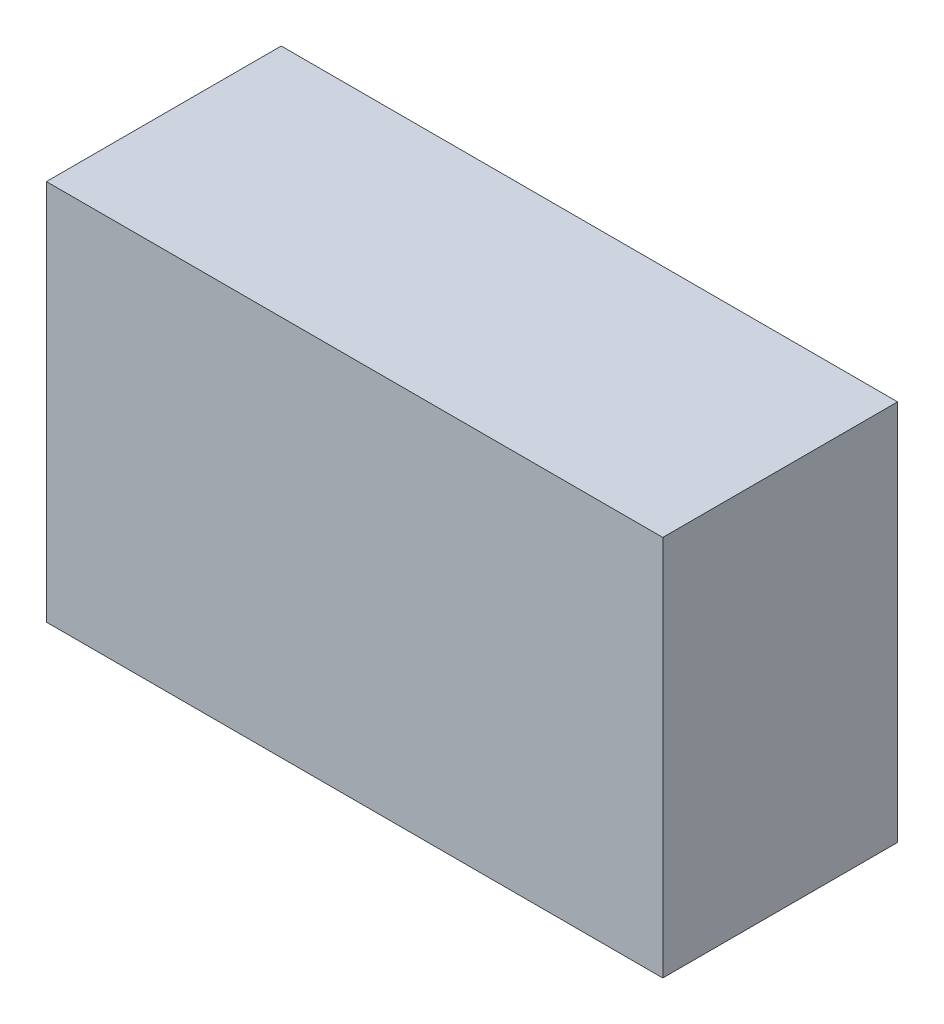
ISO-10303-21;
HEADER;
FILE_DESCRIPTION(('STEP AP214'),'2;1');
FILE_NAME('part.step','',(''),(''),'','','');
FILE_SCHEMA(('AUTOMOTIVE_DESIGN { 1 0 10303 214 1 1 1 1 }'));
ENDSEC;
DATA;
#1=APPLICATION_CONTEXT('core data for automotive mechanical design processes');
#2=APPLICATION_PROTOCOL_DEFINITION('international standard','automotive_design',2000,#1);
#3=PRODUCT_CONTEXT('',#1,'mechanical');
#4=PRODUCT('Part','Part','',(#3));
#5=PRODUCT_RELATED_PRODUCT_CATEGORY('part','',(#4));
#6=PRODUCT_DEFINITION_FORMATION('','',#4);
#7=PRODUCT_DEFINITION_CONTEXT('part definition',#1,'design');
#8=PRODUCT_DEFINITION('design','',#6,#7);
#9=PRODUCT_DEFINITION_SHAPE('','',#8);
#10=(LENGTH_UNIT() NAMED_UNIT(*) SI_UNIT(.MILLI.,.METRE.));
#11=(NAMED_UNIT(*) PLANE_ANGLE_UNIT() SI_UNIT($,.RADIAN.));
#12=(NAMED_UNIT(*) SI_UNIT($,.STERADIAN.) SOLID_ANGLE_UNIT());
#13=UNCERTAINTY_MEASURE_WITH_UNIT(LENGTH_MEASURE(1.E-05),#10,'distance_accuracy_value','');
#14=(GEOMETRIC_REPRESENTATION_CONTEXT(3) GLOBAL_UNCERTAINTY_ASSIGNED_CONTEXT((#13)) GLOBAL_UNIT_ASSIGNED_CONTEXT((#10,
#11,#12)) REPRESENTATION_CONTEXT('',''));
#15=CARTESIAN_POINT('',(0.,0.,0.));
#16=DIRECTION('',(0.,0.,1.));
#17=DIRECTION('',(1.,0.,0.));
#18=AXIS2_PLACEMENT_3D('',#15,#16,#17);
#19=CARTESIAN_POINT('',(-52.5,65.,20.));
#20=DIRECTION('',(1.,0.,0.));
#21=DIRECTION('',(0.,0.,-1.));
#22=AXIS2_PLACEMENT_3D('',#19,#20,#21);
#23=PLANE('',#22);
#24=DIRECTION('',(0.,0.,1.));
#25=VECTOR('',#24,1.);
#26=CARTESIAN_POINT('',(-52.5,0.,20.));
#27=LINE('',#26,#25);
#28=CARTESIAN_POINT('',(-52.5,0.,-20.));
#29=VERTEX_POINT('',#28);
#30=CARTESIAN_POINT('',(-52.5,0.,20.));
#31=VERTEX_POINT('',#30);
#32=EDGE_CURVE('E107',#29,#31,#27,.T.);
#33=ORIENTED_EDGE('',*,*,#32,.T.);
#34=DIRECTION('',(0.,-1.,0.));
#35=VECTOR('',#34,1.);
#36=CARTESIAN_POINT('',(-52.5,65.,20.));
#37=LINE('',#36,#35);
#38=CARTESIAN_POINT('',(-52.5,65.,20.));
#39=VERTEX_POINT('',#38);
#40=EDGE_CURVE('E11',#39,#31,#37,.T.);
#41=ORIENTED_EDGE('',*,*,#40,.F.);
#42=DIRECTION('',(0.,0.,1.));
#43=VECTOR('',#42,1.);
#44=CARTESIAN_POINT('',(-52.5,65.,20.));
#45=LINE('',#44,#43);
#46=CARTESIAN_POINT('',(-52.5,65.,-20.));
#47=VERTEX_POINT('',#46);
#48=EDGE_CURVE('E91',#47,#39,#45,.T.);
#49=ORIENTED_EDGE('',*,*,#48,.F.);
#50=DIRECTION('',(0.,-1.,0.));
#51=VECTOR('',#50,1.);
#52=CARTESIAN_POINT('',(-52.5,65.,-20.));
#53=LINE('',#52,#51);
#54=EDGE_CURVE('E103',#47,#29,#53,.T.);
#55=ORIENTED_EDGE('',*,*,#54,.T.);
#56=EDGE_LOOP('',(#33,#41,#49,#55));
#57=FACE_BOUND('',#56,.T.);
#58=ADVANCED_FACE('F39',(#57),#23,.F.);
#59=CARTESIAN_POINT('',(52.5,65.,20.));
#60=DIRECTION('',(0.,0.,-1.));
#61=DIRECTION('',(-1.,0.,0.));
#62=AXIS2_PLACEMENT_3D('',#59,#60,#61);
#63=PLANE('',#62);
#64=DIRECTION('',(1.,0.,0.));
#65=VECTOR('',#64,1.);
#66=CARTESIAN_POINT('',(52.5,0.,20.));
#67=LINE('',#66,#65);
#68=CARTESIAN_POINT('',(52.5,0.,20.));
#69=VERTEX_POINT('',#68);
#70=EDGE_CURVE('E96',#31,#69,#67,.T.);
#71=ORIENTED_EDGE('',*,*,#70,.T.);
#72=DIRECTION('',(0.,-1.,0.));
#73=VECTOR('',#72,1.);
#74=CARTESIAN_POINT('',(52.5,65.,20.));
#75=LINE('',#74,#73);
#76=CARTESIAN_POINT('',(52.5,65.,20.));
#77=VERTEX_POINT('',#76);
#78=EDGE_CURVE('E48',#77,#69,#75,.T.);
#79=ORIENTED_EDGE('',*,*,#78,.F.);
#80=DIRECTION('',(1.,0.,0.));
#81=VECTOR('',#80,1.);
#82=CARTESIAN_POINT('',(52.5,65.,20.));
#83=LINE('',#82,#81);
#84=EDGE_CURVE('E86',#39,#77,#83,.T.);
#85=ORIENTED_EDGE('',*,*,#84,.F.);
#86=ORIENTED_EDGE('',*,*,#40,.T.);
#87=EDGE_LOOP('',(#71,#79,#85,#86));
#88=FACE_BOUND('',#87,.T.);
#89=ADVANCED_FACE('F95',(#88),#63,.F.);
#90=CARTESIAN_POINT('',(52.5,65.,20.));
#91=DIRECTION('',(-1.,0.,0.));
#92=DIRECTION('',(0.,0.,1.));
#93=AXIS2_PLACEMENT_3D('',#90,#91,#92);
#94=PLANE('',#93);
#95=DIRECTION('',(0.,0.,-1.));
#96=VECTOR('',#95,1.);
#97=CARTESIAN_POINT('',(52.5,0.,20.));
#98=LINE('',#97,#96);
#99=CARTESIAN_POINT('',(52.5,0.,-20.));
#100=VERTEX_POINT('',#99);
#101=EDGE_CURVE('E73',#69,#100,#98,.T.);
#102=ORIENTED_EDGE('',*,*,#101,.T.);
#103=DIRECTION('',(0.,-1.,0.));
#104=VECTOR('',#103,1.);
#105=CARTESIAN_POINT('',(52.5,65.,-20.));
#106=LINE('',#105,#104);
#107=CARTESIAN_POINT('',(52.5,65.,-20.));
#108=VERTEX_POINT('',#107);
#109=EDGE_CURVE('E98',#108,#100,#106,.T.);
#110=ORIENTED_EDGE('',*,*,#109,.F.);
#111=DIRECTION('',(0.,0.,-1.));
#112=VECTOR('',#111,1.);
#113=CARTESIAN_POINT('',(52.5,65.,20.));
#114=LINE('',#113,#112);
#115=EDGE_CURVE('E89',#77,#108,#114,.T.);
#116=ORIENTED_EDGE('',*,*,#115,.F.);
#117=ORIENTED_EDGE('',*,*,#78,.T.);
#118=EDGE_LOOP('',(#102,#110,#116,#117));
#119=FACE_BOUND('',#118,.T.);
#120=ADVANCED_FACE('F99',(#119),#94,.F.);
#121=CARTESIAN_POINT('',(52.5,65.,-20.));
#122=DIRECTION('',(0.,0.,1.));
#123=DIRECTION('',(1.,0.,0.));
#124=AXIS2_PLACEMENT_3D('',#121,#122,#123);
#125=PLANE('',#124);
#126=DIRECTION('',(-1.,0.,0.));
#127=VECTOR('',#126,1.);
#128=CARTESIAN_POINT('',(52.5,0.,-20.));
#129=LINE('',#128,#127);
#130=EDGE_CURVE('E79',#100,#29,#129,.T.);
#131=ORIENTED_EDGE('',*,*,#130,.T.);
#132=ORIENTED_EDGE('',*,*,#54,.F.);
#133=DIRECTION('',(-1.,0.,0.));
#134=VECTOR('',#133,1.);
#135=CARTESIAN_POINT('',(52.5,65.,-20.));
#136=LINE('',#135,#134);
#137=EDGE_CURVE('E56',#108,#47,#136,.T.);
#138=ORIENTED_EDGE('',*,*,#137,.F.);
#139=ORIENTED_EDGE('',*,*,#109,.T.);
#140=EDGE_LOOP('',(#131,#132,#138,#139));
#141=FACE_BOUND('',#140,.T.);
#142=ADVANCED_FACE('F120',(#141),#125,.F.);
#143=CARTESIAN_POINT('',(0.,65.,0.));
#144=DIRECTION('',(0.,1.,0.));
#145=DIRECTION('',(0.,0.,1.));
#146=AXIS2_PLACEMENT_3D('',#143,#144,#145);
#147=PLANE('',#146);
#148=ORIENTED_EDGE('',*,*,#48,.T.);
#149=ORIENTED_EDGE('',*,*,#84,.T.);
#150=ORIENTED_EDGE('',*,*,#115,.T.);
#151=ORIENTED_EDGE('',*,*,#137,.T.);
#152=EDGE_LOOP('',(#148,#149,#150,#151));
#153=FACE_BOUND('',#152,.T.);
#154=ADVANCED_FACE('F87',(#153),#147,.T.);
#155=CARTESIAN_POINT('',(0.,0.,0.));
#156=DIRECTION('',(0.,1.,0.));
#157=DIRECTION('',(0.,0.,1.));
#158=AXIS2_PLACEMENT_3D('',#155,#156,#157);
#159=PLANE('',#158);
#160=ORIENTED_EDGE('',*,*,#32,.F.);
#161=ORIENTED_EDGE('',*,*,#130,.F.);
#162=ORIENTED_EDGE('',*,*,#101,.F.);
#163=ORIENTED_EDGE('',*,*,#70,.F.);
#164=EDGE_LOOP('',(#160,#161,#162,#163));
#165=FACE_BOUND('',#164,.T.);
#166=ADVANCED_FACE('F123',(#165),#159,.F.);
#167=CLOSED_SHELL('',(#58,#89,#120,#142,#154,#166));
#168=MANIFOLD_SOLID_BREP('B2',#167);
#169=ADVANCED_BREP_SHAPE_REPRESENTATION('',(#18,#168),#14);
#170=SHAPE_DEFINITION_REPRESENTATION(#9,#169);
ENDSEC;
END-ISO-10303-21;
